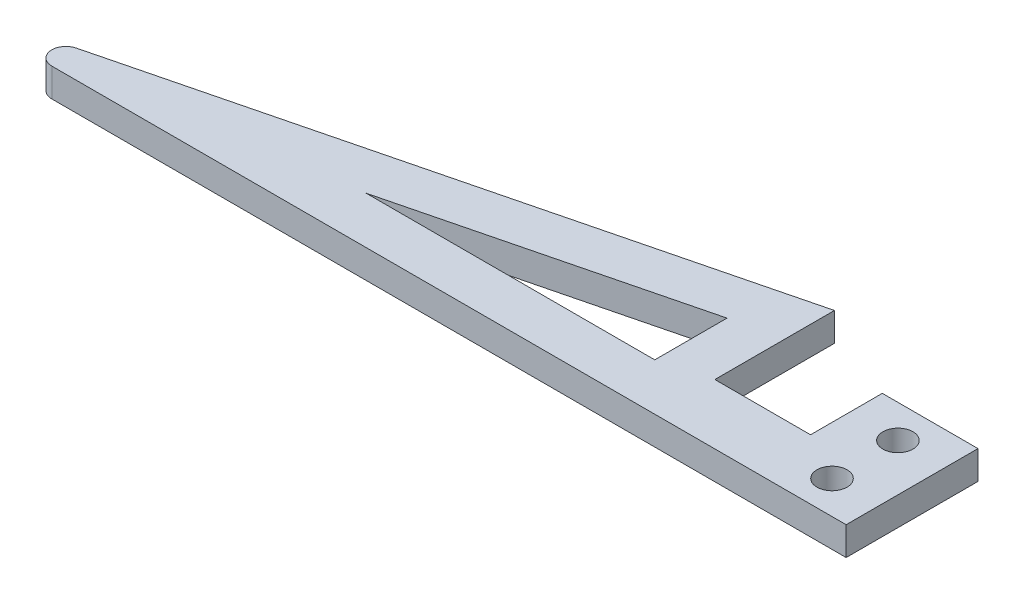
ISO-10303-21;
HEADER;
FILE_DESCRIPTION(('STEP AP214'),'2;1');
FILE_NAME('part.step','',(''),(''),'','','');
FILE_SCHEMA(('AUTOMOTIVE_DESIGN { 1 0 10303 214 1 1 1 1 }'));
ENDSEC;
DATA;
#1=APPLICATION_CONTEXT('core data for automotive mechanical design processes');
#2=APPLICATION_PROTOCOL_DEFINITION('international standard','automotive_design',2000,#1);
#3=PRODUCT_CONTEXT('',#1,'mechanical');
#4=PRODUCT('Part','Part','',(#3));
#5=PRODUCT_RELATED_PRODUCT_CATEGORY('part','',(#4));
#6=PRODUCT_DEFINITION_FORMATION('','',#4);
#7=PRODUCT_DEFINITION_CONTEXT('part definition',#1,'design');
#8=PRODUCT_DEFINITION('design','',#6,#7);
#9=PRODUCT_DEFINITION_SHAPE('','',#8);
#10=(LENGTH_UNIT() NAMED_UNIT(*) SI_UNIT(.MILLI.,.METRE.));
#11=(NAMED_UNIT(*) PLANE_ANGLE_UNIT() SI_UNIT($,.RADIAN.));
#12=(NAMED_UNIT(*) SI_UNIT($,.STERADIAN.) SOLID_ANGLE_UNIT());
#13=UNCERTAINTY_MEASURE_WITH_UNIT(LENGTH_MEASURE(1.E-05),#10,'distance_accuracy_value','');
#14=(GEOMETRIC_REPRESENTATION_CONTEXT(3) GLOBAL_UNCERTAINTY_ASSIGNED_CONTEXT((#13)) GLOBAL_UNIT_ASSIGNED_CONTEXT((#10,
#11,#12)) REPRESENTATION_CONTEXT('',''));
#15=CARTESIAN_POINT('',(0.,0.,0.));
#16=DIRECTION('',(0.,0.,1.));
#17=DIRECTION('',(1.,0.,0.));
#18=AXIS2_PLACEMENT_3D('',#15,#16,#17);
#19=CARTESIAN_POINT('',(0.,3.0226,0.));
#20=DIRECTION('',(0.,1.,0.));
#21=DIRECTION('',(0.,0.,1.));
#22=AXIS2_PLACEMENT_3D('',#19,#20,#21);
#23=PLANE('',#22);
#24=CARTESIAN_POINT('',(-5.,3.0226,2.85));
#25=DIRECTION('',(0.,1.,0.));
#26=DIRECTION('',(0.,0.,1.));
#27=AXIS2_PLACEMENT_3D('',#24,#25,#26);
#28=CIRCLE('',#27,1.6);
#29=CARTESIAN_POINT('',(-5.,3.0226,4.45));
#30=VERTEX_POINT('',#29);
#31=EDGE_CURVE('E334',#30,#30,#28,.T.);
#32=ORIENTED_EDGE('',*,*,#31,.F.);
#33=EDGE_LOOP('',(#32));
#34=FACE_BOUND('',#33,.T.);
#35=DIRECTION('',(-0.970037545400835,0.,0.242955058627565));
#36=VECTOR('',#35,1.);
#37=CARTESIAN_POINT('',(-20.32,3.0226,-12.73));
#38=LINE('',#37,#36);
#39=CARTESIAN_POINT('',(-20.32,3.0226,-12.73));
#40=VERTEX_POINT('',#39);
#41=CARTESIAN_POINT('',(-84.7014575307676,3.0226,3.39494368189876));
#42=VERTEX_POINT('',#41);
#43=EDGE_CURVE('E173',#40,#42,#38,.T.);
#44=ORIENTED_EDGE('',*,*,#43,.T.);
#45=CARTESIAN_POINT('',(-84.3370249428263,3.0226,4.85000000000001));
#46=DIRECTION('',(0.,1.,0.));
#47=DIRECTION('',(0.,0.,1.));
#48=AXIS2_PLACEMENT_3D('',#45,#46,#47);
#49=CIRCLE('',#48,1.5);
#50=CARTESIAN_POINT('',(-84.3370249428263,3.0226,6.35000000000001));
#51=VERTEX_POINT('',#50);
#52=EDGE_CURVE('E12',#42,#51,#49,.T.);
#53=ORIENTED_EDGE('',*,*,#52,.T.);
#54=DIRECTION('',(1.,0.,0.));
#55=VECTOR('',#54,1.);
#56=CARTESIAN_POINT('',(0.,3.0226,6.35));
#57=LINE('',#56,#55);
#58=CARTESIAN_POINT('',(0.,3.0226,6.35));
#59=VERTEX_POINT('',#58);
#60=EDGE_CURVE('E180',#51,#59,#57,.T.);
#61=ORIENTED_EDGE('',*,*,#60,.T.);
#62=DIRECTION('',(0.,0.,-1.));
#63=VECTOR('',#62,1.);
#64=CARTESIAN_POINT('',(0.,3.0226,6.35));
#65=LINE('',#64,#63);
#66=CARTESIAN_POINT('',(0.,3.0226,-7.65));
#67=VERTEX_POINT('',#66);
#68=EDGE_CURVE('E192',#59,#67,#65,.T.);
#69=ORIENTED_EDGE('',*,*,#68,.T.);
#70=DIRECTION('',(-1.,0.,0.));
#71=VECTOR('',#70,1.);
#72=CARTESIAN_POINT('',(0.,3.0226,-7.65));
#73=LINE('',#72,#71);
#74=CARTESIAN_POINT('',(-10.16,3.0226,-7.65));
#75=VERTEX_POINT('',#74);
#76=EDGE_CURVE('E196',#67,#75,#73,.T.);
#77=ORIENTED_EDGE('',*,*,#76,.T.);
#78=DIRECTION('',(0.,0.,1.));
#79=VECTOR('',#78,1.);
#80=CARTESIAN_POINT('',(-10.16,3.0226,-7.65));
#81=LINE('',#80,#79);
#82=CARTESIAN_POINT('',(-10.16,3.0226,-0.0300000000000022));
#83=VERTEX_POINT('',#82);
#84=EDGE_CURVE('E201',#75,#83,#81,.T.);
#85=ORIENTED_EDGE('',*,*,#84,.T.);
#86=DIRECTION('',(-1.,0.,0.));
#87=VECTOR('',#86,1.);
#88=CARTESIAN_POINT('',(-20.32,3.0226,-0.0300000000000022));
#89=LINE('',#88,#87);
#90=CARTESIAN_POINT('',(-20.32,3.0226,-0.0300000000000022));
#91=VERTEX_POINT('',#90);
#92=EDGE_CURVE('E174',#83,#91,#89,.T.);
#93=ORIENTED_EDGE('',*,*,#92,.T.);
#94=DIRECTION('',(0.,0.,-1.));
#95=VECTOR('',#94,1.);
#96=CARTESIAN_POINT('',(-20.32,3.0226,-0.0300000000000022));
#97=LINE('',#96,#95);
#98=EDGE_CURVE('E169',#91,#40,#97,.T.);
#99=ORIENTED_EDGE('',*,*,#98,.T.);
#100=EDGE_LOOP('',(#44,#53,#61,#69,#77,#85,#93,#99));
#101=FACE_BOUND('',#100,.T.);
#102=DIRECTION('',(1.,0.,0.));
#103=VECTOR('',#102,1.);
#104=CARTESIAN_POINT('',(-25.32,3.0226,1.35));
#105=LINE('',#104,#103);
#106=CARTESIAN_POINT('',(-55.956749809421,3.0226,1.35));
#107=VERTEX_POINT('',#106);
#108=CARTESIAN_POINT('',(-25.32,3.0226,1.35));
#109=VERTEX_POINT('',#108);
#110=EDGE_CURVE('E139',#107,#109,#105,.T.);
#111=ORIENTED_EDGE('',*,*,#110,.F.);
#112=DIRECTION('',(-0.970037545400835,0.,0.242955058627566));
#113=VECTOR('',#112,1.);
#114=CARTESIAN_POINT('',(-25.32,3.0226,-6.32326314470665));
#115=LINE('',#114,#113);
#116=CARTESIAN_POINT('',(-25.32,3.0226,-6.32326314470665));
#117=VERTEX_POINT('',#116);
#118=EDGE_CURVE('E128',#117,#107,#115,.T.);
#119=ORIENTED_EDGE('',*,*,#118,.F.);
#120=DIRECTION('',(0.,0.,-1.));
#121=VECTOR('',#120,1.);
#122=CARTESIAN_POINT('',(-25.32,3.0226,1.35));
#123=LINE('',#122,#121);
#124=EDGE_CURVE('E152',#109,#117,#123,.T.);
#125=ORIENTED_EDGE('',*,*,#124,.F.);
#126=EDGE_LOOP('',(#111,#119,#125));
#127=FACE_BOUND('',#126,.T.);
#128=CARTESIAN_POINT('',(-5.,3.0226,-4.15));
#129=DIRECTION('',(0.,1.,0.));
#130=DIRECTION('',(0.,0.,1.));
#131=AXIS2_PLACEMENT_3D('',#128,#129,#130);
#132=CIRCLE('',#131,1.6);
#133=CARTESIAN_POINT('',(-5.,3.0226,-2.55));
#134=VERTEX_POINT('',#133);
#135=EDGE_CURVE('E324',#134,#134,#132,.T.);
#136=ORIENTED_EDGE('',*,*,#135,.F.);
#137=EDGE_LOOP('',(#136));
#138=FACE_BOUND('',#137,.T.);
#139=ADVANCED_FACE('F42',(#34,#101,#127,#138),#23,.T.);
#140=CARTESIAN_POINT('',(0.,0.,0.));
#141=DIRECTION('',(0.,1.,0.));
#142=DIRECTION('',(0.,0.,1.));
#143=AXIS2_PLACEMENT_3D('',#140,#141,#142);
#144=PLANE('',#143);
#145=DIRECTION('',(1.,0.,0.));
#146=VECTOR('',#145,1.);
#147=CARTESIAN_POINT('',(0.,0.,6.35));
#148=LINE('',#147,#146);
#149=CARTESIAN_POINT('',(-84.3370249428263,0.,6.35000000000001));
#150=VERTEX_POINT('',#149);
#151=CARTESIAN_POINT('',(0.,0.,6.35));
#152=VERTEX_POINT('',#151);
#153=EDGE_CURVE('E197',#150,#152,#148,.T.);
#154=ORIENTED_EDGE('',*,*,#153,.F.);
#155=CARTESIAN_POINT('',(-84.3370249428263,0.,4.85000000000001));
#156=DIRECTION('',(0.,1.,0.));
#157=DIRECTION('',(0.,0.,1.));
#158=AXIS2_PLACEMENT_3D('',#155,#156,#157);
#159=CIRCLE('',#158,1.5);
#160=CARTESIAN_POINT('',(-84.7014575307676,0.,3.39494368189876));
#161=VERTEX_POINT('',#160);
#162=EDGE_CURVE('E66',#150,#161,#159,.F.);
#163=ORIENTED_EDGE('',*,*,#162,.T.);
#164=DIRECTION('',(-0.970037545400835,0.,0.242955058627565));
#165=VECTOR('',#164,1.);
#166=CARTESIAN_POINT('',(-20.32,0.,-12.73));
#167=LINE('',#166,#165);
#168=CARTESIAN_POINT('',(-20.32,0.,-12.73));
#169=VERTEX_POINT('',#168);
#170=EDGE_CURVE('E260',#169,#161,#167,.T.);
#171=ORIENTED_EDGE('',*,*,#170,.F.);
#172=DIRECTION('',(0.,0.,-1.));
#173=VECTOR('',#172,1.);
#174=CARTESIAN_POINT('',(-20.32,0.,-0.0300000000000022));
#175=LINE('',#174,#173);
#176=CARTESIAN_POINT('',(-20.32,0.,-0.0300000000000022));
#177=VERTEX_POINT('',#176);
#178=EDGE_CURVE('E227',#177,#169,#175,.T.);
#179=ORIENTED_EDGE('',*,*,#178,.F.);
#180=DIRECTION('',(-1.,0.,0.));
#181=VECTOR('',#180,1.);
#182=CARTESIAN_POINT('',(-20.32,0.,-0.0300000000000022));
#183=LINE('',#182,#181);
#184=CARTESIAN_POINT('',(-10.16,0.,-0.0300000000000022));
#185=VERTEX_POINT('',#184);
#186=EDGE_CURVE('E218',#185,#177,#183,.T.);
#187=ORIENTED_EDGE('',*,*,#186,.F.);
#188=DIRECTION('',(0.,0.,1.));
#189=VECTOR('',#188,1.);
#190=CARTESIAN_POINT('',(-10.16,0.,-7.65));
#191=LINE('',#190,#189);
#192=CARTESIAN_POINT('',(-10.16,0.,-7.65));
#193=VERTEX_POINT('',#192);
#194=EDGE_CURVE('E267',#193,#185,#191,.T.);
#195=ORIENTED_EDGE('',*,*,#194,.F.);
#196=DIRECTION('',(-1.,0.,0.));
#197=VECTOR('',#196,1.);
#198=CARTESIAN_POINT('',(0.,0.,-7.65));
#199=LINE('',#198,#197);
#200=CARTESIAN_POINT('',(0.,0.,-7.65));
#201=VERTEX_POINT('',#200);
#202=EDGE_CURVE('E270',#201,#193,#199,.T.);
#203=ORIENTED_EDGE('',*,*,#202,.F.);
#204=DIRECTION('',(0.,0.,-1.));
#205=VECTOR('',#204,1.);
#206=CARTESIAN_POINT('',(0.,0.,6.35));
#207=LINE('',#206,#205);
#208=EDGE_CURVE('E148',#152,#201,#207,.T.);
#209=ORIENTED_EDGE('',*,*,#208,.F.);
#210=EDGE_LOOP('',(#154,#163,#171,#179,#187,#195,#203,#209));
#211=FACE_BOUND('',#210,.T.);
#212=DIRECTION('',(-0.970037545400835,0.,0.242955058627566));
#213=VECTOR('',#212,1.);
#214=CARTESIAN_POINT('',(-25.32,0.,-6.32326314470665));
#215=LINE('',#214,#213);
#216=CARTESIAN_POINT('',(-25.32,0.,-6.32326314470665));
#217=VERTEX_POINT('',#216);
#218=CARTESIAN_POINT('',(-55.956749809421,0.,1.35));
#219=VERTEX_POINT('',#218);
#220=EDGE_CURVE('E338',#217,#219,#215,.T.);
#221=ORIENTED_EDGE('',*,*,#220,.T.);
#222=DIRECTION('',(1.,0.,0.));
#223=VECTOR('',#222,1.);
#224=CARTESIAN_POINT('',(-25.32,0.,1.35));
#225=LINE('',#224,#223);
#226=CARTESIAN_POINT('',(-25.32,0.,1.35));
#227=VERTEX_POINT('',#226);
#228=EDGE_CURVE('E146',#219,#227,#225,.T.);
#229=ORIENTED_EDGE('',*,*,#228,.T.);
#230=DIRECTION('',(0.,0.,-1.));
#231=VECTOR('',#230,1.);
#232=CARTESIAN_POINT('',(-25.32,0.,1.35));
#233=LINE('',#232,#231);
#234=EDGE_CURVE('E140',#227,#217,#233,.T.);
#235=ORIENTED_EDGE('',*,*,#234,.T.);
#236=EDGE_LOOP('',(#221,#229,#235));
#237=FACE_BOUND('',#236,.T.);
#238=CARTESIAN_POINT('',(-5.,0.,2.85));
#239=DIRECTION('',(0.,1.,0.));
#240=DIRECTION('',(0.,0.,1.));
#241=AXIS2_PLACEMENT_3D('',#238,#239,#240);
#242=CIRCLE('',#241,1.6);
#243=CARTESIAN_POINT('',(-5.,0.,4.45));
#244=VERTEX_POINT('',#243);
#245=EDGE_CURVE('E332',#244,#244,#242,.T.);
#246=ORIENTED_EDGE('',*,*,#245,.T.);
#247=EDGE_LOOP('',(#246));
#248=FACE_BOUND('',#247,.T.);
#249=CARTESIAN_POINT('',(-5.,0.,-4.15));
#250=DIRECTION('',(0.,1.,0.));
#251=DIRECTION('',(0.,0.,1.));
#252=AXIS2_PLACEMENT_3D('',#249,#250,#251);
#253=CIRCLE('',#252,1.6);
#254=CARTESIAN_POINT('',(-5.,0.,-2.55));
#255=VERTEX_POINT('',#254);
#256=EDGE_CURVE('E327',#255,#255,#253,.T.);
#257=ORIENTED_EDGE('',*,*,#256,.T.);
#258=EDGE_LOOP('',(#257));
#259=FACE_BOUND('',#258,.T.);
#260=ADVANCED_FACE('F280',(#211,#237,#248,#259),#144,.F.);
#261=CARTESIAN_POINT('',(0.,3.0226,6.35));
#262=DIRECTION('',(-1.,0.,0.));
#263=DIRECTION('',(0.,0.,1.));
#264=AXIS2_PLACEMENT_3D('',#261,#262,#263);
#265=PLANE('',#264);
#266=ORIENTED_EDGE('',*,*,#208,.T.);
#267=DIRECTION('',(0.,-1.,0.));
#268=VECTOR('',#267,1.);
#269=CARTESIAN_POINT('',(0.,3.0226,-7.65));
#270=LINE('',#269,#268);
#271=EDGE_CURVE('E240',#67,#201,#270,.T.);
#272=ORIENTED_EDGE('',*,*,#271,.F.);
#273=ORIENTED_EDGE('',*,*,#68,.F.);
#274=DIRECTION('',(0.,-1.,0.));
#275=VECTOR('',#274,1.);
#276=CARTESIAN_POINT('',(0.,3.0226,6.35));
#277=LINE('',#276,#275);
#278=EDGE_CURVE('E229',#59,#152,#277,.T.);
#279=ORIENTED_EDGE('',*,*,#278,.T.);
#280=EDGE_LOOP('',(#266,#272,#273,#279));
#281=FACE_BOUND('',#280,.T.);
#282=ADVANCED_FACE('F277',(#281),#265,.F.);
#283=CARTESIAN_POINT('',(0.,3.0226,-7.65));
#284=DIRECTION('',(0.,0.,1.));
#285=DIRECTION('',(1.,0.,0.));
#286=AXIS2_PLACEMENT_3D('',#283,#284,#285);
#287=PLANE('',#286);
#288=ORIENTED_EDGE('',*,*,#202,.T.);
#289=DIRECTION('',(0.,-1.,0.));
#290=VECTOR('',#289,1.);
#291=CARTESIAN_POINT('',(-10.16,3.0226,-7.65));
#292=LINE('',#291,#290);
#293=EDGE_CURVE('E246',#75,#193,#292,.T.);
#294=ORIENTED_EDGE('',*,*,#293,.F.);
#295=ORIENTED_EDGE('',*,*,#76,.F.);
#296=ORIENTED_EDGE('',*,*,#271,.T.);
#297=EDGE_LOOP('',(#288,#294,#295,#296));
#298=FACE_BOUND('',#297,.T.);
#299=ADVANCED_FACE('F285',(#298),#287,.F.);
#300=CARTESIAN_POINT('',(-10.16,3.0226,-7.65));
#301=DIRECTION('',(1.,0.,0.));
#302=DIRECTION('',(0.,0.,-1.));
#303=AXIS2_PLACEMENT_3D('',#300,#301,#302);
#304=PLANE('',#303);
#305=ORIENTED_EDGE('',*,*,#194,.T.);
#306=DIRECTION('',(0.,-1.,0.));
#307=VECTOR('',#306,1.);
#308=CARTESIAN_POINT('',(-10.16,3.0226,-0.0300000000000022));
#309=LINE('',#308,#307);
#310=EDGE_CURVE('E222',#83,#185,#309,.T.);
#311=ORIENTED_EDGE('',*,*,#310,.F.);
#312=ORIENTED_EDGE('',*,*,#84,.F.);
#313=ORIENTED_EDGE('',*,*,#293,.T.);
#314=EDGE_LOOP('',(#305,#311,#312,#313));
#315=FACE_BOUND('',#314,.T.);
#316=ADVANCED_FACE('F423',(#315),#304,.F.);
#317=CARTESIAN_POINT('',(-20.32,3.0226,-0.0300000000000022));
#318=DIRECTION('',(0.,0.,1.));
#319=DIRECTION('',(1.,0.,0.));
#320=AXIS2_PLACEMENT_3D('',#317,#318,#319);
#321=PLANE('',#320);
#322=ORIENTED_EDGE('',*,*,#186,.T.);
#323=DIRECTION('',(0.,-1.,0.));
#324=VECTOR('',#323,1.);
#325=CARTESIAN_POINT('',(-20.32,3.0226,-0.0300000000000022));
#326=LINE('',#325,#324);
#327=EDGE_CURVE('E215',#91,#177,#326,.T.);
#328=ORIENTED_EDGE('',*,*,#327,.F.);
#329=ORIENTED_EDGE('',*,*,#92,.F.);
#330=ORIENTED_EDGE('',*,*,#310,.T.);
#331=EDGE_LOOP('',(#322,#328,#329,#330));
#332=FACE_BOUND('',#331,.T.);
#333=ADVANCED_FACE('F216',(#332),#321,.F.);
#334=CARTESIAN_POINT('',(-20.32,3.0226,-0.0300000000000022));
#335=DIRECTION('',(-1.,0.,0.));
#336=DIRECTION('',(0.,0.,1.));
#337=AXIS2_PLACEMENT_3D('',#334,#335,#336);
#338=PLANE('',#337);
#339=ORIENTED_EDGE('',*,*,#178,.T.);
#340=DIRECTION('',(0.,-1.,0.));
#341=VECTOR('',#340,1.);
#342=CARTESIAN_POINT('',(-20.32,3.0226,-12.73));
#343=LINE('',#342,#341);
#344=EDGE_CURVE('E223',#40,#169,#343,.T.);
#345=ORIENTED_EDGE('',*,*,#344,.F.);
#346=ORIENTED_EDGE('',*,*,#98,.F.);
#347=ORIENTED_EDGE('',*,*,#327,.T.);
#348=EDGE_LOOP('',(#339,#345,#346,#347));
#349=FACE_BOUND('',#348,.T.);
#350=ADVANCED_FACE('F225',(#349),#338,.F.);
#351=CARTESIAN_POINT('',(-20.32,3.0226,-12.73));
#352=DIRECTION('',(0.242955058627565,0.,0.970037545400835));
#353=DIRECTION('',(0.970037545400835,0.,-0.242955058627565));
#354=AXIS2_PLACEMENT_3D('',#351,#352,#353);
#355=PLANE('',#354);
#356=ORIENTED_EDGE('',*,*,#170,.T.);
#357=DIRECTION('',(0.,-1.,0.));
#358=VECTOR('',#357,1.);
#359=CARTESIAN_POINT('',(-84.7014575307676,3.0226,3.39494368189876));
#360=LINE('',#359,#358);
#361=EDGE_CURVE('E52',#161,#42,#360,.F.);
#362=ORIENTED_EDGE('',*,*,#361,.T.);
#363=ORIENTED_EDGE('',*,*,#43,.F.);
#364=ORIENTED_EDGE('',*,*,#344,.T.);
#365=EDGE_LOOP('',(#356,#362,#363,#364));
#366=FACE_BOUND('',#365,.T.);
#367=ADVANCED_FACE('F231',(#366),#355,.F.);
#368=CARTESIAN_POINT('',(0.,3.0226,6.35));
#369=DIRECTION('',(0.,0.,-1.));
#370=DIRECTION('',(-1.,0.,0.));
#371=AXIS2_PLACEMENT_3D('',#368,#369,#370);
#372=PLANE('',#371);
#373=ORIENTED_EDGE('',*,*,#60,.F.);
#374=DIRECTION('',(0.,-1.,0.));
#375=VECTOR('',#374,1.);
#376=CARTESIAN_POINT('',(-84.3370249428263,3.0226,6.35000000000001));
#377=LINE('',#376,#375);
#378=EDGE_CURVE('E237',#51,#150,#377,.T.);
#379=ORIENTED_EDGE('',*,*,#378,.T.);
#380=ORIENTED_EDGE('',*,*,#153,.T.);
#381=ORIENTED_EDGE('',*,*,#278,.F.);
#382=EDGE_LOOP('',(#373,#379,#380,#381));
#383=FACE_BOUND('',#382,.T.);
#384=ADVANCED_FACE('F287',(#383),#372,.F.);
#385=CARTESIAN_POINT('',(-25.32,3.0226,-6.32326314470665));
#386=DIRECTION('',(0.242955058627565,0.,0.970037545400835));
#387=DIRECTION('',(0.970037545400835,0.,-0.242955058627566));
#388=AXIS2_PLACEMENT_3D('',#385,#386,#387);
#389=PLANE('',#388);
#390=ORIENTED_EDGE('',*,*,#220,.F.);
#391=DIRECTION('',(0.,-1.,0.));
#392=VECTOR('',#391,1.);
#393=CARTESIAN_POINT('',(-25.32,3.0226,-6.32326314470665));
#394=LINE('',#393,#392);
#395=EDGE_CURVE('E134',#117,#217,#394,.T.);
#396=ORIENTED_EDGE('',*,*,#395,.F.);
#397=ORIENTED_EDGE('',*,*,#118,.T.);
#398=DIRECTION('',(0.,-1.,0.));
#399=VECTOR('',#398,1.);
#400=CARTESIAN_POINT('',(-55.956749809421,3.0226,1.35));
#401=LINE('',#400,#399);
#402=EDGE_CURVE('E131',#107,#219,#401,.T.);
#403=ORIENTED_EDGE('',*,*,#402,.T.);
#404=EDGE_LOOP('',(#390,#396,#397,#403));
#405=FACE_BOUND('',#404,.T.);
#406=ADVANCED_FACE('F130',(#405),#389,.T.);
#407=CARTESIAN_POINT('',(-25.32,3.0226,1.35));
#408=DIRECTION('',(0.,0.,-1.));
#409=DIRECTION('',(-1.,0.,0.));
#410=AXIS2_PLACEMENT_3D('',#407,#408,#409);
#411=PLANE('',#410);
#412=ORIENTED_EDGE('',*,*,#228,.F.);
#413=ORIENTED_EDGE('',*,*,#402,.F.);
#414=ORIENTED_EDGE('',*,*,#110,.T.);
#415=DIRECTION('',(0.,-1.,0.));
#416=VECTOR('',#415,1.);
#417=CARTESIAN_POINT('',(-25.32,3.0226,1.35));
#418=LINE('',#417,#416);
#419=EDGE_CURVE('E149',#109,#227,#418,.T.);
#420=ORIENTED_EDGE('',*,*,#419,.T.);
#421=EDGE_LOOP('',(#412,#413,#414,#420));
#422=FACE_BOUND('',#421,.T.);
#423=ADVANCED_FACE('F144',(#422),#411,.T.);
#424=CARTESIAN_POINT('',(-25.32,3.0226,1.35));
#425=DIRECTION('',(-1.,0.,0.));
#426=DIRECTION('',(0.,0.,1.));
#427=AXIS2_PLACEMENT_3D('',#424,#425,#426);
#428=PLANE('',#427);
#429=ORIENTED_EDGE('',*,*,#234,.F.);
#430=ORIENTED_EDGE('',*,*,#419,.F.);
#431=ORIENTED_EDGE('',*,*,#124,.T.);
#432=ORIENTED_EDGE('',*,*,#395,.T.);
#433=EDGE_LOOP('',(#429,#430,#431,#432));
#434=FACE_BOUND('',#433,.T.);
#435=ADVANCED_FACE('F307',(#434),#428,.T.);
#436=CARTESIAN_POINT('',(-5.,3.0226,2.85));
#437=DIRECTION('',(0.,-1.,0.));
#438=DIRECTION('',(0.,0.,-1.));
#439=AXIS2_PLACEMENT_3D('',#436,#437,#438);
#440=CYLINDRICAL_SURFACE('',#439,1.6);
#441=ORIENTED_EDGE('',*,*,#31,.T.);
#442=EDGE_LOOP('',(#441));
#443=FACE_BOUND('',#442,.T.);
#444=ORIENTED_EDGE('',*,*,#245,.F.);
#445=EDGE_LOOP('',(#444));
#446=FACE_BOUND('',#445,.T.);
#447=ADVANCED_FACE('F310',(#443,#446),#440,.F.);
#448=CARTESIAN_POINT('',(-5.,3.0226,-4.15));
#449=DIRECTION('',(0.,-1.,0.));
#450=DIRECTION('',(0.,0.,-1.));
#451=AXIS2_PLACEMENT_3D('',#448,#449,#450);
#452=CYLINDRICAL_SURFACE('',#451,1.6);
#453=ORIENTED_EDGE('',*,*,#135,.T.);
#454=EDGE_LOOP('',(#453));
#455=FACE_BOUND('',#454,.T.);
#456=ORIENTED_EDGE('',*,*,#256,.F.);
#457=EDGE_LOOP('',(#456));
#458=FACE_BOUND('',#457,.T.);
#459=ADVANCED_FACE('F314',(#455,#458),#452,.F.);
#460=CARTESIAN_POINT('',(-84.3370249428263,3.0226,4.85000000000001));
#461=DIRECTION('',(0.,-1.,0.));
#462=DIRECTION('',(0.,0.,-1.));
#463=AXIS2_PLACEMENT_3D('',#460,#461,#462);
#464=CYLINDRICAL_SURFACE('',#463,1.5);
#465=ORIENTED_EDGE('',*,*,#52,.F.);
#466=ORIENTED_EDGE('',*,*,#361,.F.);
#467=ORIENTED_EDGE('',*,*,#162,.F.);
#468=ORIENTED_EDGE('',*,*,#378,.F.);
#469=EDGE_LOOP('',(#465,#466,#467,#468));
#470=FACE_BOUND('',#469,.T.);
#471=ADVANCED_FACE('F44',(#470),#464,.T.);
#472=CLOSED_SHELL('',(#139,#260,#282,#299,#316,#333,#350,#367,#384,#406,#423,#435,#447,#459,#471));
#473=MANIFOLD_SOLID_BREP('B2',#472);
#474=ADVANCED_BREP_SHAPE_REPRESENTATION('',(#18,#473),#14);
#475=SHAPE_DEFINITION_REPRESENTATION(#9,#474);
ENDSEC;
END-ISO-10303-21;
